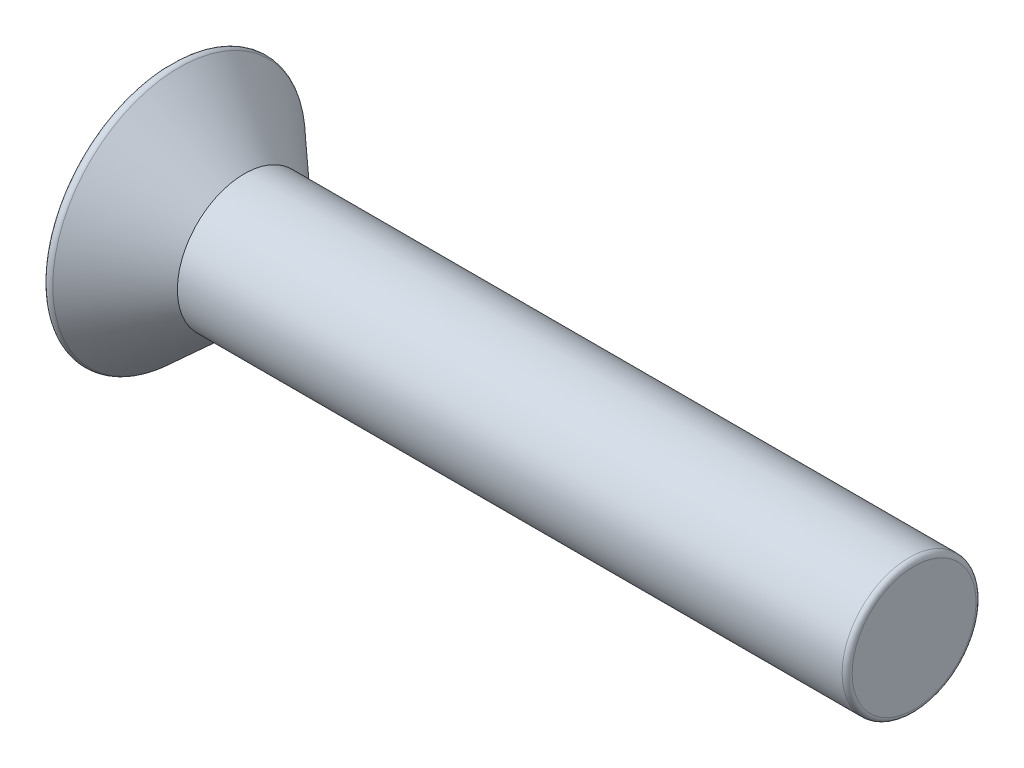
ISO-10303-21;
HEADER;
FILE_DESCRIPTION(('STEP AP214'),'2;1');
FILE_NAME('part.step','',(''),(''),'','','');
FILE_SCHEMA(('AUTOMOTIVE_DESIGN { 1 0 10303 214 1 1 1 1 }'));
ENDSEC;
DATA;
#1=APPLICATION_CONTEXT('core data for automotive mechanical design processes');
#2=APPLICATION_PROTOCOL_DEFINITION('international standard','automotive_design',2000,#1);
#3=PRODUCT_CONTEXT('',#1,'mechanical');
#4=PRODUCT('Part','Part','',(#3));
#5=PRODUCT_RELATED_PRODUCT_CATEGORY('part','',(#4));
#6=PRODUCT_DEFINITION_FORMATION('','',#4);
#7=PRODUCT_DEFINITION_CONTEXT('part definition',#1,'design');
#8=PRODUCT_DEFINITION('design','',#6,#7);
#9=PRODUCT_DEFINITION_SHAPE('','',#8);
#10=(LENGTH_UNIT() NAMED_UNIT(*) SI_UNIT(.MILLI.,.METRE.));
#11=(NAMED_UNIT(*) PLANE_ANGLE_UNIT() SI_UNIT($,.RADIAN.));
#12=(NAMED_UNIT(*) SI_UNIT($,.STERADIAN.) SOLID_ANGLE_UNIT());
#13=UNCERTAINTY_MEASURE_WITH_UNIT(LENGTH_MEASURE(1.E-05),#10,'distance_accuracy_value','');
#14=(GEOMETRIC_REPRESENTATION_CONTEXT(3) GLOBAL_UNCERTAINTY_ASSIGNED_CONTEXT((#13)) GLOBAL_UNIT_ASSIGNED_CONTEXT((#10,
#11,#12)) REPRESENTATION_CONTEXT('',''));
#15=CARTESIAN_POINT('',(0.,0.,0.));
#16=DIRECTION('',(0.,0.,1.));
#17=DIRECTION('',(1.,0.,0.));
#18=AXIS2_PLACEMENT_3D('',#15,#16,#17);
#19=CARTESIAN_POINT('',(0.,0.,0.));
#20=DIRECTION('',(-1.,0.,0.));
#21=DIRECTION('',(0.,0.,1.));
#22=AXIS2_PLACEMENT_3D('',#19,#20,#21);
#23=PLANE('',#22);
#24=CARTESIAN_POINT('',(0.,0.,0.));
#25=DIRECTION('',(-1.,0.,0.));
#26=DIRECTION('',(0.,0.,1.));
#27=AXIS2_PLACEMENT_3D('',#24,#25,#26);
#28=CIRCLE('',#27,3.7);
#29=CARTESIAN_POINT('',(0.,0.,3.7));
#30=VERTEX_POINT('',#29);
#31=EDGE_CURVE('E151',#30,#30,#28,.F.);
#32=ORIENTED_EDGE('',*,*,#31,.T.);
#33=EDGE_LOOP('',(#32));
#34=FACE_BOUND('',#33,.T.);
#35=ADVANCED_FACE('F38',(#34),#23,.F.);
#36=CARTESIAN_POINT('',(-44.4,0.,0.));
#37=DIRECTION('',(-1.,0.,0.));
#38=DIRECTION('',(0.,0.,1.));
#39=AXIS2_PLACEMENT_3D('',#36,#37,#38);
#40=CYLINDRICAL_SURFACE('',#39,4.);
#41=CARTESIAN_POINT('',(-0.300000000000002,0.,0.));
#42=DIRECTION('',(-1.,0.,0.));
#43=DIRECTION('',(0.,0.,1.));
#44=AXIS2_PLACEMENT_3D('',#41,#42,#43);
#45=CIRCLE('',#44,4.);
#46=CARTESIAN_POINT('',(-0.300000000000002,0.,4.));
#47=VERTEX_POINT('',#46);
#48=EDGE_CURVE('E148',#47,#47,#45,.T.);
#49=ORIENTED_EDGE('',*,*,#48,.T.);
#50=EDGE_LOOP('',(#49));
#51=FACE_BOUND('',#50,.T.);
#52=CARTESIAN_POINT('',(-40.,0.,0.));
#53=DIRECTION('',(-1.,0.,0.));
#54=DIRECTION('',(0.,0.,1.));
#55=AXIS2_PLACEMENT_3D('',#52,#53,#54);
#56=CIRCLE('',#55,3.99999999999999);
#57=CARTESIAN_POINT('',(-40.,0.,3.99999999999999));
#58=VERTEX_POINT('',#57);
#59=EDGE_CURVE('E140',#58,#58,#56,.T.);
#60=ORIENTED_EDGE('',*,*,#59,.F.);
#61=EDGE_LOOP('',(#60));
#62=FACE_BOUND('',#61,.T.);
#63=ADVANCED_FACE('F168',(#51,#62),#40,.T.);
#64=CARTESIAN_POINT('',(-40.,0.,0.));
#65=DIRECTION('',(-1.,0.,0.));
#66=DIRECTION('',(0.,0.,1.));
#67=AXIS2_PLACEMENT_3D('',#64,#65,#66);
#68=CONICAL_SURFACE('',#67,3.99999999999999,0.737815060120465);
#69=CARTESIAN_POINT('',(-43.8981981618011,0.,0.));
#70=DIRECTION('',(1.,0.,0.));
#71=DIRECTION('',(0.,0.,-1.));
#72=AXIS2_PLACEMENT_3D('',#69,#70,#71);
#73=CIRCLE('',#72,7.54381651072828);
#74=CARTESIAN_POINT('',(-43.8981981618011,0.,-7.54381651072828));
#75=VERTEX_POINT('',#74);
#76=EDGE_CURVE('E11',#75,#75,#73,.T.);
#77=ORIENTED_EDGE('',*,*,#76,.T.);
#78=EDGE_LOOP('',(#77));
#79=FACE_BOUND('',#78,.T.);
#80=ORIENTED_EDGE('',*,*,#59,.T.);
#81=EDGE_LOOP('',(#80));
#82=FACE_BOUND('',#81,.T.);
#83=ADVANCED_FACE('F174',(#79,#82),#68,.T.);
#84=CARTESIAN_POINT('',(-44.4,8.,0.));
#85=DIRECTION('',(1.,0.,0.));
#86=DIRECTION('',(0.,0.,-1.));
#87=AXIS2_PLACEMENT_3D('',#84,#85,#86);
#88=PLANE('',#87);
#89=CARTESIAN_POINT('',(-44.4,0.,0.));
#90=DIRECTION('',(1.,0.,0.));
#91=DIRECTION('',(0.,0.,-1.));
#92=AXIS2_PLACEMENT_3D('',#89,#90,#91);
#93=CIRCLE('',#92,7.32183448870949);
#94=CARTESIAN_POINT('',(-44.4,0.,-7.32183448870949));
#95=VERTEX_POINT('',#94);
#96=EDGE_CURVE('E46',#95,#95,#93,.F.);
#97=ORIENTED_EDGE('',*,*,#96,.T.);
#98=EDGE_LOOP('',(#97));
#99=FACE_BOUND('',#98,.T.);
#100=DIRECTION('',(0.,0.866025403784438,-0.5));
#101=VECTOR('',#100,1.);
#102=CARTESIAN_POINT('',(-44.4,0.,2.88675134594813));
#103=LINE('',#102,#101);
#104=CARTESIAN_POINT('',(-44.4,0.,2.88675134594813));
#105=VERTEX_POINT('',#104);
#106=CARTESIAN_POINT('',(-44.4,2.5,1.44337567297406));
#107=VERTEX_POINT('',#106);
#108=EDGE_CURVE('E127',#105,#107,#103,.T.);
#109=ORIENTED_EDGE('',*,*,#108,.F.);
#110=DIRECTION('',(0.,0.866025403784439,0.5));
#111=VECTOR('',#110,1.);
#112=CARTESIAN_POINT('',(-44.4,-2.5,1.44337567297406));
#113=LINE('',#112,#111);
#114=CARTESIAN_POINT('',(-44.4,-2.5,1.44337567297406));
#115=VERTEX_POINT('',#114);
#116=EDGE_CURVE('E53',#115,#105,#113,.T.);
#117=ORIENTED_EDGE('',*,*,#116,.F.);
#118=DIRECTION('',(0.,0.,1.));
#119=VECTOR('',#118,1.);
#120=CARTESIAN_POINT('',(-44.4,-2.5,-1.44337567297407));
#121=LINE('',#120,#119);
#122=CARTESIAN_POINT('',(-44.4,-2.5,-1.44337567297407));
#123=VERTEX_POINT('',#122);
#124=EDGE_CURVE('E136',#123,#115,#121,.T.);
#125=ORIENTED_EDGE('',*,*,#124,.F.);
#126=DIRECTION('',(0.,-0.866025403784439,0.5));
#127=VECTOR('',#126,1.);
#128=CARTESIAN_POINT('',(-44.4,0.,-2.88675134594813));
#129=LINE('',#128,#127);
#130=CARTESIAN_POINT('',(-44.4,0.,-2.88675134594813));
#131=VERTEX_POINT('',#130);
#132=EDGE_CURVE('E134',#131,#123,#129,.T.);
#133=ORIENTED_EDGE('',*,*,#132,.F.);
#134=DIRECTION('',(0.,-0.866025403784439,-0.5));
#135=VECTOR('',#134,1.);
#136=CARTESIAN_POINT('',(-44.4,2.5,-1.44337567297407));
#137=LINE('',#136,#135);
#138=CARTESIAN_POINT('',(-44.4,2.5,-1.44337567297407));
#139=VERTEX_POINT('',#138);
#140=EDGE_CURVE('E101',#139,#131,#137,.T.);
#141=ORIENTED_EDGE('',*,*,#140,.F.);
#142=DIRECTION('',(0.,0.,-1.));
#143=VECTOR('',#142,1.);
#144=CARTESIAN_POINT('',(-44.4,2.5,1.44337567297406));
#145=LINE('',#144,#143);
#146=EDGE_CURVE('E130',#107,#139,#145,.T.);
#147=ORIENTED_EDGE('',*,*,#146,.F.);
#148=EDGE_LOOP('',(#109,#117,#125,#133,#141,#147));
#149=FACE_BOUND('',#148,.T.);
#150=ADVANCED_FACE('F156',(#99,#149),#88,.F.);
#151=CARTESIAN_POINT('',(-39.4,-2.5,1.44337567297406));
#152=DIRECTION('',(0.,-0.5,0.866025403784439));
#153=DIRECTION('',(0.,-0.866025403784439,-0.5));
#154=AXIS2_PLACEMENT_3D('',#151,#152,#153);
#155=PLANE('',#154);
#156=ORIENTED_EDGE('',*,*,#116,.T.);
#157=DIRECTION('',(-1.,0.,0.));
#158=VECTOR('',#157,1.);
#159=CARTESIAN_POINT('',(-39.4,0.,2.88675134594813));
#160=LINE('',#159,#158);
#161=CARTESIAN_POINT('',(-39.4,0.,2.88675134594813));
#162=VERTEX_POINT('',#161);
#163=EDGE_CURVE('E83',#162,#105,#160,.T.);
#164=ORIENTED_EDGE('',*,*,#163,.F.);
#165=DIRECTION('',(0.,0.866025403784439,0.5));
#166=VECTOR('',#165,1.);
#167=CARTESIAN_POINT('',(-39.4,-2.5,1.44337567297406));
#168=LINE('',#167,#166);
#169=CARTESIAN_POINT('',(-39.4,-2.5,1.44337567297406));
#170=VERTEX_POINT('',#169);
#171=EDGE_CURVE('E138',#170,#162,#168,.T.);
#172=ORIENTED_EDGE('',*,*,#171,.F.);
#173=DIRECTION('',(-1.,0.,0.));
#174=VECTOR('',#173,1.);
#175=CARTESIAN_POINT('',(-39.4,-2.5,1.44337567297406));
#176=LINE('',#175,#174);
#177=EDGE_CURVE('E61',#170,#115,#176,.T.);
#178=ORIENTED_EDGE('',*,*,#177,.T.);
#179=EDGE_LOOP('',(#156,#164,#172,#178));
#180=FACE_BOUND('',#179,.T.);
#181=ADVANCED_FACE('F183',(#180),#155,.F.);
#182=CARTESIAN_POINT('',(-39.4,-2.5,-1.44337567297407));
#183=DIRECTION('',(0.,-1.,0.));
#184=DIRECTION('',(0.,0.,-1.));
#185=AXIS2_PLACEMENT_3D('',#182,#183,#184);
#186=PLANE('',#185);
#187=ORIENTED_EDGE('',*,*,#124,.T.);
#188=ORIENTED_EDGE('',*,*,#177,.F.);
#189=DIRECTION('',(0.,0.,1.));
#190=VECTOR('',#189,1.);
#191=CARTESIAN_POINT('',(-39.4,-2.5,-1.44337567297407));
#192=LINE('',#191,#190);
#193=CARTESIAN_POINT('',(-39.4,-2.5,-1.44337567297407));
#194=VERTEX_POINT('',#193);
#195=EDGE_CURVE('E113',#194,#170,#192,.T.);
#196=ORIENTED_EDGE('',*,*,#195,.F.);
#197=DIRECTION('',(-1.,0.,0.));
#198=VECTOR('',#197,1.);
#199=CARTESIAN_POINT('',(-39.4,-2.5,-1.44337567297407));
#200=LINE('',#199,#198);
#201=EDGE_CURVE('E105',#194,#123,#200,.T.);
#202=ORIENTED_EDGE('',*,*,#201,.T.);
#203=EDGE_LOOP('',(#187,#188,#196,#202));
#204=FACE_BOUND('',#203,.T.);
#205=ADVANCED_FACE('F186',(#204),#186,.F.);
#206=CARTESIAN_POINT('',(-39.4,0.,-2.88675134594813));
#207=DIRECTION('',(0.,-0.5,-0.866025403784439));
#208=DIRECTION('',(0.,0.866025403784439,-0.5));
#209=AXIS2_PLACEMENT_3D('',#206,#207,#208);
#210=PLANE('',#209);
#211=ORIENTED_EDGE('',*,*,#132,.T.);
#212=ORIENTED_EDGE('',*,*,#201,.F.);
#213=DIRECTION('',(0.,-0.866025403784439,0.5));
#214=VECTOR('',#213,1.);
#215=CARTESIAN_POINT('',(-39.4,0.,-2.88675134594813));
#216=LINE('',#215,#214);
#217=CARTESIAN_POINT('',(-39.4,0.,-2.88675134594813));
#218=VERTEX_POINT('',#217);
#219=EDGE_CURVE('E109',#218,#194,#216,.T.);
#220=ORIENTED_EDGE('',*,*,#219,.F.);
#221=DIRECTION('',(-1.,0.,0.));
#222=VECTOR('',#221,1.);
#223=CARTESIAN_POINT('',(-39.4,0.,-2.88675134594813));
#224=LINE('',#223,#222);
#225=EDGE_CURVE('E94',#218,#131,#224,.T.);
#226=ORIENTED_EDGE('',*,*,#225,.T.);
#227=EDGE_LOOP('',(#211,#212,#220,#226));
#228=FACE_BOUND('',#227,.T.);
#229=ADVANCED_FACE('F110',(#228),#210,.F.);
#230=CARTESIAN_POINT('',(-39.4,2.5,-1.44337567297407));
#231=DIRECTION('',(0.,0.5,-0.866025403784439));
#232=DIRECTION('',(0.,0.866025403784439,0.5));
#233=AXIS2_PLACEMENT_3D('',#230,#231,#232);
#234=PLANE('',#233);
#235=ORIENTED_EDGE('',*,*,#140,.T.);
#236=ORIENTED_EDGE('',*,*,#225,.F.);
#237=DIRECTION('',(0.,-0.866025403784439,-0.5));
#238=VECTOR('',#237,1.);
#239=CARTESIAN_POINT('',(-39.4,2.5,-1.44337567297407));
#240=LINE('',#239,#238);
#241=CARTESIAN_POINT('',(-39.4,2.5,-1.44337567297407));
#242=VERTEX_POINT('',#241);
#243=EDGE_CURVE('E98',#242,#218,#240,.T.);
#244=ORIENTED_EDGE('',*,*,#243,.F.);
#245=DIRECTION('',(-1.,0.,0.));
#246=VECTOR('',#245,1.);
#247=CARTESIAN_POINT('',(-39.4,2.5,-1.44337567297407));
#248=LINE('',#247,#246);
#249=EDGE_CURVE('E106',#242,#139,#248,.T.);
#250=ORIENTED_EDGE('',*,*,#249,.T.);
#251=EDGE_LOOP('',(#235,#236,#244,#250));
#252=FACE_BOUND('',#251,.T.);
#253=ADVANCED_FACE('F96',(#252),#234,.F.);
#254=CARTESIAN_POINT('',(-39.4,2.5,1.44337567297406));
#255=DIRECTION('',(0.,1.,0.));
#256=DIRECTION('',(0.,0.,1.));
#257=AXIS2_PLACEMENT_3D('',#254,#255,#256);
#258=PLANE('',#257);
#259=ORIENTED_EDGE('',*,*,#146,.T.);
#260=ORIENTED_EDGE('',*,*,#249,.F.);
#261=DIRECTION('',(0.,0.,-1.));
#262=VECTOR('',#261,1.);
#263=CARTESIAN_POINT('',(-39.4,2.5,1.44337567297406));
#264=LINE('',#263,#262);
#265=CARTESIAN_POINT('',(-39.4,2.5,1.44337567297406));
#266=VERTEX_POINT('',#265);
#267=EDGE_CURVE('E119',#266,#242,#264,.T.);
#268=ORIENTED_EDGE('',*,*,#267,.F.);
#269=DIRECTION('',(-1.,0.,0.));
#270=VECTOR('',#269,1.);
#271=CARTESIAN_POINT('',(-39.4,2.5,1.44337567297406));
#272=LINE('',#271,#270);
#273=EDGE_CURVE('E143',#266,#107,#272,.T.);
#274=ORIENTED_EDGE('',*,*,#273,.T.);
#275=EDGE_LOOP('',(#259,#260,#268,#274));
#276=FACE_BOUND('',#275,.T.);
#277=ADVANCED_FACE('F190',(#276),#258,.F.);
#278=CARTESIAN_POINT('',(-39.4,0.,2.88675134594813));
#279=DIRECTION('',(0.,0.5,0.866025403784439));
#280=DIRECTION('',(0.,-0.866025403784439,0.5));
#281=AXIS2_PLACEMENT_3D('',#278,#279,#280);
#282=PLANE('',#281);
#283=ORIENTED_EDGE('',*,*,#108,.T.);
#284=ORIENTED_EDGE('',*,*,#273,.F.);
#285=DIRECTION('',(0.,0.866025403784438,-0.5));
#286=VECTOR('',#285,1.);
#287=CARTESIAN_POINT('',(-39.4,0.,2.88675134594813));
#288=LINE('',#287,#286);
#289=EDGE_CURVE('E121',#162,#266,#288,.T.);
#290=ORIENTED_EDGE('',*,*,#289,.F.);
#291=ORIENTED_EDGE('',*,*,#163,.T.);
#292=EDGE_LOOP('',(#283,#284,#290,#291));
#293=FACE_BOUND('',#292,.T.);
#294=ADVANCED_FACE('F187',(#293),#282,.F.);
#295=CARTESIAN_POINT('',(-39.4,0.,0.));
#296=DIRECTION('',(-1.,0.,0.));
#297=DIRECTION('',(0.,0.,1.));
#298=AXIS2_PLACEMENT_3D('',#295,#296,#297);
#299=PLANE('',#298);
#300=ORIENTED_EDGE('',*,*,#171,.T.);
#301=ORIENTED_EDGE('',*,*,#289,.T.);
#302=ORIENTED_EDGE('',*,*,#267,.T.);
#303=ORIENTED_EDGE('',*,*,#243,.T.);
#304=ORIENTED_EDGE('',*,*,#219,.T.);
#305=ORIENTED_EDGE('',*,*,#195,.T.);
#306=EDGE_LOOP('',(#300,#301,#302,#303,#304,#305));
#307=FACE_BOUND('',#306,.T.);
#308=ADVANCED_FACE('F116',(#307),#299,.T.);
#309=CARTESIAN_POINT('',(-0.300000000000002,0.,0.));
#310=DIRECTION('',(-1.,0.,0.));
#311=DIRECTION('',(0.,0.,1.));
#312=AXIS2_PLACEMENT_3D('',#309,#310,#311);
#313=TOROIDAL_SURFACE('',#312,3.7,0.3);
#314=ORIENTED_EDGE('',*,*,#31,.F.);
#315=EDGE_LOOP('',(#314));
#316=FACE_BOUND('',#315,.T.);
#317=ORIENTED_EDGE('',*,*,#48,.F.);
#318=EDGE_LOOP('',(#317));
#319=FACE_BOUND('',#318,.T.);
#320=ADVANCED_FACE('F160',(#316,#319),#313,.T.);
#321=CARTESIAN_POINT('',(-44.1,0.,0.));
#322=DIRECTION('',(1.,0.,0.));
#323=DIRECTION('',(0.,0.,-1.));
#324=AXIS2_PLACEMENT_3D('',#321,#322,#323);
#325=TOROIDAL_SURFACE('',#324,7.32183448870949,0.3);
#326=ORIENTED_EDGE('',*,*,#76,.F.);
#327=EDGE_LOOP('',(#326));
#328=FACE_BOUND('',#327,.T.);
#329=ORIENTED_EDGE('',*,*,#96,.F.);
#330=EDGE_LOOP('',(#329));
#331=FACE_BOUND('',#330,.T.);
#332=ADVANCED_FACE('F40',(#328,#331),#325,.T.);
#333=CLOSED_SHELL('',(#35,#63,#83,#150,#181,#205,#229,#253,#277,#294,#308,#320,#332));
#334=MANIFOLD_SOLID_BREP('B2',#333);
#335=ADVANCED_BREP_SHAPE_REPRESENTATION('',(#18,#334),#14);
#336=SHAPE_DEFINITION_REPRESENTATION(#9,#335);
ENDSEC;
END-ISO-10303-21;
